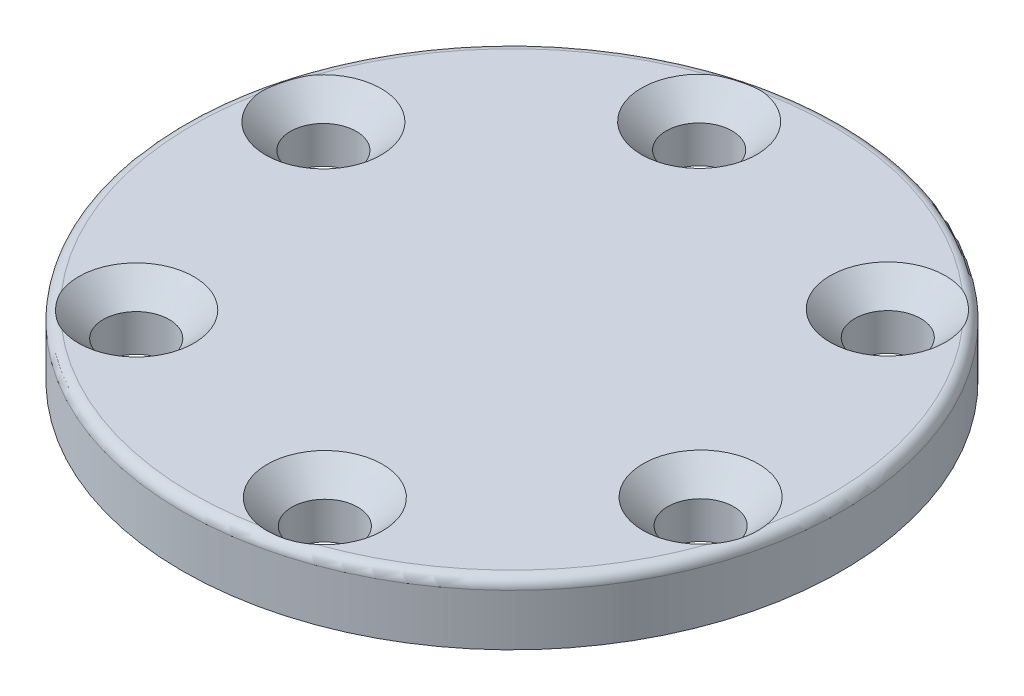
ISO-10303-21;
HEADER;
FILE_DESCRIPTION(('STEP AP214'),'2;1');
FILE_NAME('part.step','',(''),(''),'','','');
FILE_SCHEMA(('AUTOMOTIVE_DESIGN { 1 0 10303 214 1 1 1 1 }'));
ENDSEC;
DATA;
#1=APPLICATION_CONTEXT('core data for automotive mechanical design processes');
#2=APPLICATION_PROTOCOL_DEFINITION('international standard','automotive_design',2000,#1);
#3=PRODUCT_CONTEXT('',#1,'mechanical');
#4=PRODUCT('Part','Part','',(#3));
#5=PRODUCT_RELATED_PRODUCT_CATEGORY('part','',(#4));
#6=PRODUCT_DEFINITION_FORMATION('','',#4);
#7=PRODUCT_DEFINITION_CONTEXT('part definition',#1,'design');
#8=PRODUCT_DEFINITION('design','',#6,#7);
#9=PRODUCT_DEFINITION_SHAPE('','',#8);
#10=(LENGTH_UNIT() NAMED_UNIT(*) SI_UNIT(.MILLI.,.METRE.));
#11=(NAMED_UNIT(*) PLANE_ANGLE_UNIT() SI_UNIT($,.RADIAN.));
#12=(NAMED_UNIT(*) SI_UNIT($,.STERADIAN.) SOLID_ANGLE_UNIT());
#13=UNCERTAINTY_MEASURE_WITH_UNIT(LENGTH_MEASURE(1.E-05),#10,'distance_accuracy_value','');
#14=(GEOMETRIC_REPRESENTATION_CONTEXT(3) GLOBAL_UNCERTAINTY_ASSIGNED_CONTEXT((#13)) GLOBAL_UNIT_ASSIGNED_CONTEXT((#10,
#11,#12)) REPRESENTATION_CONTEXT('',''));
#15=CARTESIAN_POINT('',(0.,0.,0.));
#16=DIRECTION('',(0.,0.,1.));
#17=DIRECTION('',(1.,0.,0.));
#18=AXIS2_PLACEMENT_3D('',#15,#16,#17);
#19=CARTESIAN_POINT('',(27.1383866400148,3.,2.07384475105819));
#20=DIRECTION('',(0.,1.,0.));
#21=DIRECTION('',(0.,0.,1.));
#22=AXIS2_PLACEMENT_3D('',#19,#20,#21);
#23=PLANE('',#22);
#24=CARTESIAN_POINT('',(23.7717611025677,3.,-10.3790999806351));
#25=DIRECTION('',(0.,1.,0.));
#26=DIRECTION('',(0.,0.,1.));
#27=AXIS2_PLACEMENT_3D('',#24,#25,#26);
#28=CIRCLE('',#27,2.80000000000002);
#29=CARTESIAN_POINT('',(24.203075595972,3.,-13.1456805068045));
#30=VERTEX_POINT('',#29);
#31=CARTESIAN_POINT('',(22.0052066267614,3.,-12.5514915852978));
#32=VERTEX_POINT('',#31);
#33=EDGE_CURVE('E281',#30,#32,#28,.F.);
#34=ORIENTED_EDGE('',*,*,#33,.T.);
#35=CARTESIAN_POINT('',(27.1383866400148,3.,2.07384475105819));
#36=DIRECTION('',(0.,1.,0.));
#37=DIRECTION('',(0.,0.,1.));
#38=AXIS2_PLACEMENT_3D('',#35,#36,#37);
#39=CIRCLE('',#38,15.5);
#40=CARTESIAN_POINT('',(12.4902356111447,3.,-2.99386394572104));
#41=VERTEX_POINT('',#40);
#42=EDGE_CURVE('E122',#32,#41,#39,.T.);
#43=ORIENTED_EDGE('',*,*,#42,.T.);
#44=CARTESIAN_POINT('',(14.6705073817217,3.,-1.23704437432932));
#45=DIRECTION('',(0.,1.,0.));
#46=DIRECTION('',(0.,0.,1.));
#47=AXIS2_PLACEMENT_3D('',#44,#45,#46);
#48=CIRCLE('',#47,2.80000000000002);
#49=CARTESIAN_POINT('',(11.9058838272124,3.,-0.793359123445086));
#50=VERTEX_POINT('',#49);
#51=EDGE_CURVE('E278',#41,#50,#48,.F.);
#52=ORIENTED_EDGE('',*,*,#51,.T.);
#53=CARTESIAN_POINT('',(27.1383866400148,3.,2.07384475105819));
#54=DIRECTION('',(0.,1.,0.));
#55=DIRECTION('',(0.,0.,1.));
#56=AXIS2_PLACEMENT_3D('',#53,#54,#55);
#57=CIRCLE('',#56,15.5);
#58=CARTESIAN_POINT('',(15.4255466551902,3.,12.2256613121419));
#59=VERTEX_POINT('',#58);
#60=EDGE_CURVE('E110',#50,#59,#57,.T.);
#61=ORIENTED_EDGE('',*,*,#60,.T.);
#62=CARTESIAN_POINT('',(18.0371329191695,3.,11.2159003573638));
#63=DIRECTION('',(0.,1.,0.));
#64=DIRECTION('',(0.,0.,1.));
#65=AXIS2_PLACEMENT_3D('',#62,#63,#64);
#66=CIRCLE('',#65,2.80000000000002);
#67=CARTESIAN_POINT('',(17.0390638404652,3.,13.8319772129119));
#68=VERTEX_POINT('',#67);
#69=EDGE_CURVE('E100',#59,#68,#66,.F.);
#70=ORIENTED_EDGE('',*,*,#69,.T.);
#71=CARTESIAN_POINT('',(27.1383866400148,3.,2.07384475105819));
#72=DIRECTION('',(0.,1.,0.));
#73=DIRECTION('',(0.,0.,1.));
#74=AXIS2_PLACEMENT_3D('',#71,#72,#73);
#75=CIRCLE('',#74,15.5);
#76=CARTESIAN_POINT('',(30.0736976840593,3.,17.2933700089206));
#77=VERTEX_POINT('',#76);
#78=EDGE_CURVE('E108',#68,#77,#75,.T.);
#79=ORIENTED_EDGE('',*,*,#78,.T.);
#80=CARTESIAN_POINT('',(30.5050121774633,3.,14.5267894827512));
#81=DIRECTION('',(0.,1.,0.));
#82=DIRECTION('',(0.,0.,1.));
#83=AXIS2_PLACEMENT_3D('',#80,#81,#82);
#84=CIRCLE('',#83,2.80000000000002);
#85=CARTESIAN_POINT('',(32.2715666532698,3.,16.6991810874136));
#86=VERTEX_POINT('',#85);
#87=EDGE_CURVE('E113',#77,#86,#84,.F.);
#88=ORIENTED_EDGE('',*,*,#87,.T.);
#89=CARTESIAN_POINT('',(27.1383866400148,3.,2.07384475105819));
#90=DIRECTION('',(0.,1.,0.));
#91=DIRECTION('',(0.,0.,1.));
#92=AXIS2_PLACEMENT_3D('',#89,#90,#91);
#93=CIRCLE('',#92,15.5);
#94=CARTESIAN_POINT('',(41.7865376688841,3.,7.14155344783979));
#95=VERTEX_POINT('',#94);
#96=EDGE_CURVE('E118',#86,#95,#93,.T.);
#97=ORIENTED_EDGE('',*,*,#96,.T.);
#98=CARTESIAN_POINT('',(39.6062658983092,3.,5.38473387644533));
#99=DIRECTION('',(0.,1.,0.));
#100=DIRECTION('',(0.,0.,1.));
#101=AXIS2_PLACEMENT_3D('',#98,#99,#100);
#102=CIRCLE('',#101,2.80000000000002);
#103=CARTESIAN_POINT('',(42.370889452818,3.,4.94104862555732));
#104=VERTEX_POINT('',#103);
#105=EDGE_CURVE('E288',#95,#104,#102,.F.);
#106=ORIENTED_EDGE('',*,*,#105,.T.);
#107=CARTESIAN_POINT('',(27.1383866400148,3.,2.07384475105819));
#108=DIRECTION('',(0.,1.,0.));
#109=DIRECTION('',(0.,0.,1.));
#110=AXIS2_PLACEMENT_3D('',#107,#108,#109);
#111=CIRCLE('',#110,15.5);
#112=CARTESIAN_POINT('',(38.8512266248422,3.,-8.0779718100223));
#113=VERTEX_POINT('',#112);
#114=EDGE_CURVE('E124',#104,#113,#111,.T.);
#115=ORIENTED_EDGE('',*,*,#114,.T.);
#116=CARTESIAN_POINT('',(36.2396403608614,3.,-7.06821085524782));
#117=DIRECTION('',(0.,1.,0.));
#118=DIRECTION('',(0.,0.,1.));
#119=AXIS2_PLACEMENT_3D('',#116,#117,#118);
#120=CIRCLE('',#119,2.80000000000002);
#121=CARTESIAN_POINT('',(37.2377094395624,3.,-9.68428771079718));
#122=VERTEX_POINT('',#121);
#123=EDGE_CURVE('E284',#113,#122,#120,.F.);
#124=ORIENTED_EDGE('',*,*,#123,.T.);
#125=CARTESIAN_POINT('',(27.1383866400148,3.,2.07384475105819));
#126=DIRECTION('',(0.,1.,0.));
#127=DIRECTION('',(0.,0.,1.));
#128=AXIS2_PLACEMENT_3D('',#125,#126,#127);
#129=CIRCLE('',#128,15.5);
#130=EDGE_CURVE('E311',#122,#30,#129,.T.);
#131=ORIENTED_EDGE('',*,*,#130,.T.);
#132=EDGE_LOOP('',(#34,#43,#52,#61,#70,#79,#88,#97,#106,#115,#124,#131));
#133=FACE_BOUND('',#132,.T.);
#134=ADVANCED_FACE('F41',(#133),#23,.T.);
#135=CARTESIAN_POINT('',(27.1383866400148,0.,2.07384475105819));
#136=DIRECTION('',(0.,1.,0.));
#137=DIRECTION('',(0.,0.,1.));
#138=AXIS2_PLACEMENT_3D('',#135,#136,#137);
#139=PLANE('',#138);
#140=CARTESIAN_POINT('',(27.1383866400148,0.,2.07384475105819));
#141=DIRECTION('',(0.,1.,0.));
#142=DIRECTION('',(0.,0.,1.));
#143=AXIS2_PLACEMENT_3D('',#140,#141,#142);
#144=CIRCLE('',#143,16.);
#145=CARTESIAN_POINT('',(27.1383866400148,0.,18.0738447510582));
#146=VERTEX_POINT('',#145);
#147=EDGE_CURVE('E270',#146,#146,#144,.T.);
#148=ORIENTED_EDGE('',*,*,#147,.F.);
#149=EDGE_LOOP('',(#148));
#150=FACE_BOUND('',#149,.T.);
#151=CARTESIAN_POINT('',(23.7717611025677,0.,-10.3790999806351));
#152=DIRECTION('',(0.,1.,0.));
#153=DIRECTION('',(0.,0.,1.));
#154=AXIS2_PLACEMENT_3D('',#151,#152,#153);
#155=CIRCLE('',#154,1.6);
#156=CARTESIAN_POINT('',(23.7717611025677,0.,-8.77909998063515));
#157=VERTEX_POINT('',#156);
#158=EDGE_CURVE('E266',#157,#157,#155,.T.);
#159=ORIENTED_EDGE('',*,*,#158,.T.);
#160=EDGE_LOOP('',(#159));
#161=FACE_BOUND('',#160,.T.);
#162=CARTESIAN_POINT('',(36.2396403608614,0.,-7.06821085524782));
#163=DIRECTION('',(0.,1.,0.));
#164=DIRECTION('',(0.,0.,1.));
#165=AXIS2_PLACEMENT_3D('',#162,#163,#164);
#166=CIRCLE('',#165,1.6);
#167=CARTESIAN_POINT('',(36.2396403608614,0.,-5.46821085524782));
#168=VERTEX_POINT('',#167);
#169=EDGE_CURVE('E262',#168,#168,#166,.T.);
#170=ORIENTED_EDGE('',*,*,#169,.T.);
#171=EDGE_LOOP('',(#170));
#172=FACE_BOUND('',#171,.T.);
#173=CARTESIAN_POINT('',(39.6062658983092,0.,5.38473387644533));
#174=DIRECTION('',(0.,1.,0.));
#175=DIRECTION('',(0.,0.,1.));
#176=AXIS2_PLACEMENT_3D('',#173,#174,#175);
#177=CIRCLE('',#176,1.6);
#178=CARTESIAN_POINT('',(39.6062658983092,0.,6.98473387644533));
#179=VERTEX_POINT('',#178);
#180=EDGE_CURVE('E258',#179,#179,#177,.T.);
#181=ORIENTED_EDGE('',*,*,#180,.T.);
#182=EDGE_LOOP('',(#181));
#183=FACE_BOUND('',#182,.T.);
#184=CARTESIAN_POINT('',(30.5050121774633,0.,14.5267894827512));
#185=DIRECTION('',(0.,1.,0.));
#186=DIRECTION('',(0.,0.,1.));
#187=AXIS2_PLACEMENT_3D('',#184,#185,#186);
#188=CIRCLE('',#187,1.6);
#189=CARTESIAN_POINT('',(30.5050121774633,0.,16.1267894827511));
#190=VERTEX_POINT('',#189);
#191=EDGE_CURVE('E252',#190,#190,#188,.T.);
#192=ORIENTED_EDGE('',*,*,#191,.T.);
#193=EDGE_LOOP('',(#192));
#194=FACE_BOUND('',#193,.T.);
#195=CARTESIAN_POINT('',(18.0371329191695,0.,11.2159003573638));
#196=DIRECTION('',(0.,1.,0.));
#197=DIRECTION('',(0.,0.,1.));
#198=AXIS2_PLACEMENT_3D('',#195,#196,#197);
#199=CIRCLE('',#198,1.6);
#200=CARTESIAN_POINT('',(18.0371329191695,0.,12.8159003573638));
#201=VERTEX_POINT('',#200);
#202=EDGE_CURVE('E248',#201,#201,#199,.T.);
#203=ORIENTED_EDGE('',*,*,#202,.T.);
#204=EDGE_LOOP('',(#203));
#205=FACE_BOUND('',#204,.T.);
#206=CARTESIAN_POINT('',(14.6705073817217,0.,-1.23704437432932));
#207=DIRECTION('',(0.,1.,0.));
#208=DIRECTION('',(0.,0.,1.));
#209=AXIS2_PLACEMENT_3D('',#206,#207,#208);
#210=CIRCLE('',#209,1.6);
#211=CARTESIAN_POINT('',(14.6705073817217,0.,0.362955625670683));
#212=VERTEX_POINT('',#211);
#213=EDGE_CURVE('E245',#212,#212,#210,.T.);
#214=ORIENTED_EDGE('',*,*,#213,.T.);
#215=EDGE_LOOP('',(#214));
#216=FACE_BOUND('',#215,.T.);
#217=ADVANCED_FACE('F209',(#150,#161,#172,#183,#194,#205,#216),#139,.F.);
#218=CARTESIAN_POINT('',(27.1383866400148,3.,2.07384475105819));
#219=DIRECTION('',(0.,-1.,0.));
#220=DIRECTION('',(0.,0.,-1.));
#221=AXIS2_PLACEMENT_3D('',#218,#219,#220);
#222=CYLINDRICAL_SURFACE('',#221,16.);
#223=CARTESIAN_POINT('',(27.1383866400148,2.5,2.07384475105819));
#224=DIRECTION('',(0.,1.,0.));
#225=DIRECTION('',(0.,0.,1.));
#226=AXIS2_PLACEMENT_3D('',#223,#224,#225);
#227=CIRCLE('',#226,16.);
#228=CARTESIAN_POINT('',(27.1383866400148,2.5,18.0738447510582));
#229=VERTEX_POINT('',#228);
#230=EDGE_CURVE('E11',#229,#229,#227,.F.);
#231=ORIENTED_EDGE('',*,*,#230,.T.);
#232=EDGE_LOOP('',(#231));
#233=FACE_BOUND('',#232,.T.);
#234=ORIENTED_EDGE('',*,*,#147,.T.);
#235=EDGE_LOOP('',(#234));
#236=FACE_BOUND('',#235,.T.);
#237=ADVANCED_FACE('F205',(#233,#236),#222,.T.);
#238=CARTESIAN_POINT('',(23.7717611025677,3.,-10.3790999806351));
#239=DIRECTION('',(0.,-1.,0.));
#240=DIRECTION('',(0.,0.,-1.));
#241=AXIS2_PLACEMENT_3D('',#238,#239,#240);
#242=CYLINDRICAL_SURFACE('',#241,1.6);
#243=CARTESIAN_POINT('',(23.7717611025677,1.79999999999999,-10.3790999806351));
#244=DIRECTION('',(0.,1.,0.));
#245=DIRECTION('',(0.,0.,1.));
#246=AXIS2_PLACEMENT_3D('',#243,#244,#245);
#247=CIRCLE('',#246,1.6);
#248=CARTESIAN_POINT('',(23.7717611025677,1.79999999999999,-8.77909998063515));
#249=VERTEX_POINT('',#248);
#250=EDGE_CURVE('E305',#249,#249,#247,.T.);
#251=ORIENTED_EDGE('',*,*,#250,.T.);
#252=EDGE_LOOP('',(#251));
#253=FACE_BOUND('',#252,.T.);
#254=ORIENTED_EDGE('',*,*,#158,.F.);
#255=EDGE_LOOP('',(#254));
#256=FACE_BOUND('',#255,.T.);
#257=ADVANCED_FACE('F208',(#253,#256),#242,.F.);
#258=CARTESIAN_POINT('',(36.2396403608614,3.,-7.06821085524782));
#259=DIRECTION('',(0.,-1.,0.));
#260=DIRECTION('',(0.,0.,-1.));
#261=AXIS2_PLACEMENT_3D('',#258,#259,#260);
#262=CYLINDRICAL_SURFACE('',#261,1.6);
#263=CARTESIAN_POINT('',(36.2396403608614,1.79999999999999,-7.06821085524782));
#264=DIRECTION('',(0.,1.,0.));
#265=DIRECTION('',(0.,0.,1.));
#266=AXIS2_PLACEMENT_3D('',#263,#264,#265);
#267=CIRCLE('',#266,1.6);
#268=CARTESIAN_POINT('',(36.2396403608614,1.79999999999999,-5.46821085524782));
#269=VERTEX_POINT('',#268);
#270=EDGE_CURVE('E301',#269,#269,#267,.T.);
#271=ORIENTED_EDGE('',*,*,#270,.T.);
#272=EDGE_LOOP('',(#271));
#273=FACE_BOUND('',#272,.T.);
#274=ORIENTED_EDGE('',*,*,#169,.F.);
#275=EDGE_LOOP('',(#274));
#276=FACE_BOUND('',#275,.T.);
#277=ADVANCED_FACE('F218',(#273,#276),#262,.F.);
#278=CARTESIAN_POINT('',(39.6062658983092,3.,5.38473387644533));
#279=DIRECTION('',(0.,-1.,0.));
#280=DIRECTION('',(0.,0.,-1.));
#281=AXIS2_PLACEMENT_3D('',#278,#279,#280);
#282=CYLINDRICAL_SURFACE('',#281,1.6);
#283=CARTESIAN_POINT('',(39.6062658983092,1.79999999999999,5.38473387644533));
#284=DIRECTION('',(0.,1.,0.));
#285=DIRECTION('',(0.,0.,1.));
#286=AXIS2_PLACEMENT_3D('',#283,#284,#285);
#287=CIRCLE('',#286,1.6);
#288=CARTESIAN_POINT('',(39.6062658983092,1.79999999999999,6.98473387644533));
#289=VERTEX_POINT('',#288);
#290=EDGE_CURVE('E297',#289,#289,#287,.T.);
#291=ORIENTED_EDGE('',*,*,#290,.T.);
#292=EDGE_LOOP('',(#291));
#293=FACE_BOUND('',#292,.T.);
#294=ORIENTED_EDGE('',*,*,#180,.F.);
#295=EDGE_LOOP('',(#294));
#296=FACE_BOUND('',#295,.T.);
#297=ADVANCED_FACE('F222',(#293,#296),#282,.F.);
#298=CARTESIAN_POINT('',(30.5050121774633,3.,14.5267894827512));
#299=DIRECTION('',(0.,-1.,0.));
#300=DIRECTION('',(0.,0.,-1.));
#301=AXIS2_PLACEMENT_3D('',#298,#299,#300);
#302=CYLINDRICAL_SURFACE('',#301,1.6);
#303=CARTESIAN_POINT('',(30.5050121774633,1.79999999999999,14.5267894827512));
#304=DIRECTION('',(0.,1.,0.));
#305=DIRECTION('',(0.,0.,1.));
#306=AXIS2_PLACEMENT_3D('',#303,#304,#305);
#307=CIRCLE('',#306,1.6);
#308=CARTESIAN_POINT('',(30.5050121774633,1.79999999999999,16.1267894827511));
#309=VERTEX_POINT('',#308);
#310=EDGE_CURVE('E112',#309,#309,#307,.T.);
#311=ORIENTED_EDGE('',*,*,#310,.T.);
#312=EDGE_LOOP('',(#311));
#313=FACE_BOUND('',#312,.T.);
#314=ORIENTED_EDGE('',*,*,#191,.F.);
#315=EDGE_LOOP('',(#314));
#316=FACE_BOUND('',#315,.T.);
#317=ADVANCED_FACE('F226',(#313,#316),#302,.F.);
#318=CARTESIAN_POINT('',(18.0371329191695,3.,11.2159003573638));
#319=DIRECTION('',(0.,-1.,0.));
#320=DIRECTION('',(0.,0.,-1.));
#321=AXIS2_PLACEMENT_3D('',#318,#319,#320);
#322=CYLINDRICAL_SURFACE('',#321,1.6);
#323=CARTESIAN_POINT('',(18.0371329191695,1.79999999999999,11.2159003573638));
#324=DIRECTION('',(0.,1.,0.));
#325=DIRECTION('',(0.,0.,1.));
#326=AXIS2_PLACEMENT_3D('',#323,#324,#325);
#327=CIRCLE('',#326,1.6);
#328=CARTESIAN_POINT('',(18.0371329191695,1.79999999999999,12.8159003573638));
#329=VERTEX_POINT('',#328);
#330=EDGE_CURVE('E274',#329,#329,#327,.T.);
#331=ORIENTED_EDGE('',*,*,#330,.T.);
#332=EDGE_LOOP('',(#331));
#333=FACE_BOUND('',#332,.T.);
#334=ORIENTED_EDGE('',*,*,#202,.F.);
#335=EDGE_LOOP('',(#334));
#336=FACE_BOUND('',#335,.T.);
#337=ADVANCED_FACE('F230',(#333,#336),#322,.F.);
#338=CARTESIAN_POINT('',(14.6705073817217,3.,-1.23704437432932));
#339=DIRECTION('',(0.,-1.,0.));
#340=DIRECTION('',(0.,0.,-1.));
#341=AXIS2_PLACEMENT_3D('',#338,#339,#340);
#342=CYLINDRICAL_SURFACE('',#341,1.6);
#343=CARTESIAN_POINT('',(14.6705073817217,1.79999999999999,-1.23704437432932));
#344=DIRECTION('',(0.,1.,0.));
#345=DIRECTION('',(0.,0.,1.));
#346=AXIS2_PLACEMENT_3D('',#343,#344,#345);
#347=CIRCLE('',#346,1.6);
#348=CARTESIAN_POINT('',(14.6705073817217,1.79999999999999,0.362955625670683));
#349=VERTEX_POINT('',#348);
#350=EDGE_CURVE('E242',#349,#349,#347,.T.);
#351=ORIENTED_EDGE('',*,*,#350,.T.);
#352=EDGE_LOOP('',(#351));
#353=FACE_BOUND('',#352,.T.);
#354=ORIENTED_EDGE('',*,*,#213,.F.);
#355=EDGE_LOOP('',(#354));
#356=FACE_BOUND('',#355,.T.);
#357=ADVANCED_FACE('F204',(#353,#356),#342,.F.);
#358=CARTESIAN_POINT('',(18.0371329191695,1.79999999999999,11.2159003573638));
#359=DIRECTION('',(0.,1.,0.));
#360=DIRECTION('',(0.,0.,1.));
#361=AXIS2_PLACEMENT_3D('',#358,#359,#360);
#362=CONICAL_SURFACE('',#361,1.6,0.785398163397452);
#363=ORIENTED_EDGE('',*,*,#69,.F.);
#364=CARTESIAN_POINT('',(15.4255466551902,3.,12.2256613121419));
#365=CARTESIAN_POINT('',(15.4369923101417,2.99998768770194,12.255230487848));
#366=CARTESIAN_POINT('',(15.4492341087631,2.99965556843646,12.2844768940821));
#367=CARTESIAN_POINT('',(15.4751054402039,2.99853655350427,12.3423213717468));
#368=CARTESIAN_POINT('',(15.4887341302601,2.99774993267797,12.3709198241483));
#369=CARTESIAN_POINT('',(15.5171595258716,2.99590820088059,12.4274426879877));
#370=CARTESIAN_POINT('',(15.5319537536436,2.9948536494084,12.4553683728721));
#371=CARTESIAN_POINT('',(15.5626076772006,2.99259619681635,12.5106264540222));
#372=CARTESIAN_POINT('',(15.5784675618831,2.99139326936374,12.5379587439612));
#373=CARTESIAN_POINT('',(15.6276322040858,2.98770309254106,12.6193307345492));
#374=CARTESIAN_POINT('',(15.6623930182709,2.98514457499136,12.6724933438453));
#375=CARTESIAN_POINT('',(15.7352011125971,2.98038713879261,12.7765718610056));
#376=CARTESIAN_POINT('',(15.7732508810453,2.97818849611607,12.8274860229885));
#377=CARTESIAN_POINT('',(15.8714422890538,2.97360146194901,12.9512847874124));
#378=CARTESIAN_POINT('',(15.9333277510663,2.97164089810886,13.0228109137072));
#379=CARTESIAN_POINT('',(16.0626372114863,2.96983600988871,13.1607131770893));
#380=CARTESIAN_POINT('',(16.1300627670596,2.96999228252874,13.2270878559841));
#381=CARTESIAN_POINT('',(16.2698465704344,2.97237269534006,13.3540397807778));
#382=CARTESIAN_POINT('',(16.3421925950188,2.97459187315201,13.414630554429));
#383=CARTESIAN_POINT('',(16.4917693159527,2.98048228507808,13.529295974699));
#384=CARTESIAN_POINT('',(16.5689964621261,2.98415247381319,13.5833752759881));
#385=CARTESIAN_POINT('',(16.710664163621,2.99073640091246,13.6723255097443));
#386=CARTESIAN_POINT('',(16.774097960735,2.99363559135205,13.7087865518481));
#387=CARTESIAN_POINT('',(16.8716168475741,2.99709477777818,13.7588599956759));
#388=CARTESIAN_POINT('',(16.9045025265929,2.99809932138951,13.7747753384928));
#389=CARTESIAN_POINT('',(16.9711363235509,2.99954281993959,13.8048051803689));
#390=CARTESIAN_POINT('',(17.004885310822,2.999981179883,13.8189177709317));
#391=CARTESIAN_POINT('',(17.0390638404627,3.00000000000426,13.8319772129156));
#392=B_SPLINE_CURVE_WITH_KNOTS('',3,(#364,#365,#366,#367,#368,#369,#370,#371,#372,#373,#374,
#375,#376,#377,#378,#379,#380,#381,#382,#383,#384,#385,#386,#387,#388,#389,#390,#391),
.UNSPECIFIED.,.F.,.F.,(4,2,2,2,2,2,2,2,2,2,2,2,2,4),(0.,0.0950884597456169,0.190119478893086,
0.284953660141675,0.379804696189655,0.570355038435373,0.761050827768602,1.04449671310302,
1.32802254150361,1.61086810293525,1.89351025889478,2.11289237160056,2.22248493740965,
2.33219257922141),.UNSPECIFIED.);
#393=EDGE_CURVE('E96',#59,#68,#392,.T.);
#394=ORIENTED_EDGE('',*,*,#393,.T.);
#395=EDGE_LOOP('',(#363,#394));
#396=FACE_BOUND('',#395,.T.);
#397=ORIENTED_EDGE('',*,*,#330,.F.);
#398=EDGE_LOOP('',(#397));
#399=FACE_BOUND('',#398,.T.);
#400=ADVANCED_FACE('F98',(#396,#399),#362,.F.);
#401=CARTESIAN_POINT('',(30.5050121774633,1.79999999999999,14.5267894827512));
#402=DIRECTION('',(0.,1.,0.));
#403=DIRECTION('',(0.,0.,1.));
#404=AXIS2_PLACEMENT_3D('',#401,#402,#403);
#405=CONICAL_SURFACE('',#404,1.6,0.785398163397452);
#406=ORIENTED_EDGE('',*,*,#87,.F.);
#407=CARTESIAN_POINT('',(30.0736976840593,3.,17.2933700089206));
#408=CARTESIAN_POINT('',(30.1050281688655,2.99998768770194,17.2982423688226));
#409=CARTESIAN_POINT('',(30.1364771989443,2.99965556843646,17.3022638633455));
#410=CARTESIAN_POINT('',(30.1995076517909,2.99853655350426,17.3087808719205));
#411=CARTESIAN_POINT('',(30.2310889831076,2.99774993267796,17.3112773063122));
#412=CARTESIAN_POINT('',(30.2942519168929,2.99590820088058,17.3149216235198));
#413=CARTESIAN_POINT('',(30.3258333833068,2.99485364940839,17.3160722888821));
#414=CARTESIAN_POINT('',(30.3890152471257,2.99259619681633,17.3171542529312));
#415=CARTESIAN_POINT('',(30.4206156468977,2.99139326936372,17.3170853348645));
#416=CARTESIAN_POINT('',(30.5156681790046,2.98770309254103,17.315193501043));
#417=CARTESIAN_POINT('',(30.579088756279,2.98514457499132,17.3116710575506));
#418=CARTESIAN_POINT('',(30.7056274432911,2.98038713879255,17.3006566568433));
#419=CARTESIAN_POINT('',(30.7687452852046,2.978188496116,17.2931616717505));
#420=CARTESIAN_POINT('',(30.9250538641571,2.9736014619489,17.2700248001939));
#421=CARTESIAN_POINT('',(31.0179400375691,2.97164089810874,17.2521934811135));
#422=CARTESIAN_POINT('',(31.2020216311074,2.96983600988854,17.2091593351313));
#423=CARTESIAN_POINT('',(31.2932165669851,2.96999228252856,17.183954430588));
#424=CARTESIAN_POINT('',(31.4730520606032,2.97237269533986,17.1263740682248));
#425=CARTESIAN_POINT('',(31.5616982221125,2.9745918731518,17.0940159598975));
#426=CARTESIAN_POINT('',(31.7357897494689,2.98048228507786,17.0218114298891));
#427=CARTESIAN_POINT('',(31.821237371291,2.98415247381298,16.9819704100857));
#428=CARTESIAN_POINT('',(31.9691043841445,2.99073640091231,16.9037576985732));
#429=CARTESIAN_POINT('',(32.0323974714124,2.99363559135194,16.8670529398656));
#430=CARTESIAN_POINT('',(32.1245217892426,2.99709477777813,16.8076358284276));
#431=CARTESIAN_POINT('',(32.1547477199416,2.99809932138948,16.7871136663849));
#432=CARTESIAN_POINT('',(32.2140712243574,2.99954281993959,16.7444220264064));
#433=CARTESIAN_POINT('',(32.2431675799338,2.999981179883,16.7222508413588));
#434=CARTESIAN_POINT('',(32.2715666532717,3.00000000000426,16.6991810874176));
#435=B_SPLINE_CURVE_WITH_KNOTS('',3,(#407,#408,#409,#410,#411,#412,#413,#414,#415,#416,#417,
#418,#419,#420,#421,#422,#423,#424,#425,#426,#427,#428,#429,#430,#431,#432,#433,#434),
.UNSPECIFIED.,.F.,.F.,(4,2,2,2,2,2,2,2,2,2,2,2,2,4),(0.,0.0950884597455397,0.190119478892934,
0.284953660141447,0.379804696189347,0.5703550384349,0.761050827767964,1.04449671310251,
1.32802254150323,1.61086810293499,1.89351025889465,2.1128923716023,2.22248493741234,
2.33219257922503),.UNSPECIFIED.);
#436=EDGE_CURVE('E103',#77,#86,#435,.T.);
#437=ORIENTED_EDGE('',*,*,#436,.T.);
#438=EDGE_LOOP('',(#406,#437));
#439=FACE_BOUND('',#438,.T.);
#440=ORIENTED_EDGE('',*,*,#310,.F.);
#441=EDGE_LOOP('',(#440));
#442=FACE_BOUND('',#441,.T.);
#443=ADVANCED_FACE('F191',(#439,#442),#405,.F.);
#444=CARTESIAN_POINT('',(39.6062658983092,1.79999999999999,5.38473387644533));
#445=DIRECTION('',(0.,1.,0.));
#446=DIRECTION('',(0.,0.,1.));
#447=AXIS2_PLACEMENT_3D('',#444,#445,#446);
#448=CONICAL_SURFACE('',#447,1.6,0.785398163397452);
#449=ORIENTED_EDGE('',*,*,#105,.F.);
#450=CARTESIAN_POINT('',(41.7865376688841,3.,7.14155344783979));
#451=CARTESIAN_POINT('',(41.8064224987387,2.99998768770194,7.11685663203579));
#452=CARTESIAN_POINT('',(41.8256297301962,2.99965556843646,7.09163172032465));
#453=CARTESIAN_POINT('',(41.862788851602,2.99853655350426,7.04030425123499));
#454=CARTESIAN_POINT('',(41.8807414928625,2.99774993267796,7.01420223322536));
#455=CARTESIAN_POINT('',(41.9154790310364,2.99590820088057,6.9613236865936));
#456=CARTESIAN_POINT('',(41.9322662696784,2.99485364940838,6.9345486670716));
#457=CARTESIAN_POINT('',(41.9647942099403,2.99259619681632,6.88037254997058));
#458=CARTESIAN_POINT('',(41.9805347250298,2.99139326936371,6.852971341965));
#459=CARTESIAN_POINT('',(42.0264226149341,2.98770309254101,6.76970751755571));
#460=CARTESIAN_POINT('',(42.0550823780235,2.98514457499129,6.71302246476724));
#461=CARTESIAN_POINT('',(42.1088129707095,2.98038713879249,6.59792954689974));
#462=CARTESIAN_POINT('',(42.133881044175,2.97818849611594,6.53952039982422));
#463=CARTESIAN_POINT('',(42.1919982151192,2.9736014619488,6.39258476384364));
#464=CARTESIAN_POINT('',(42.2229989265187,2.97164089810862,6.30322731846839));
#465=CARTESIAN_POINT('',(42.2777710596373,2.96983600988838,6.12229090910391));
#466=CARTESIAN_POINT('',(42.3015404399417,2.96999228252838,6.03071132566574));
#467=CARTESIAN_POINT('',(42.3415921301852,2.97237269533965,5.84617903850862));
#468=CARTESIAN_POINT('',(42.3578922671101,2.97459187315159,5.75323015652995));
#469=CARTESIAN_POINT('',(42.3824070735329,2.98048228507765,5.56636020625131));
#470=CARTESIAN_POINT('',(42.3906275491816,2.98415247381277,5.47243988515875));
#471=CARTESIAN_POINT('',(42.3968268605398,2.99073640091216,5.305276939889));
#472=CARTESIAN_POINT('',(42.3966861506933,2.99363559135183,5.23211113907663));
#473=CARTESIAN_POINT('',(42.3912915816835,2.99709477777808,5.12262058380945));
#474=CARTESIAN_POINT('',(42.3886318333635,2.99809932138944,5.08618307894937));
#475=CARTESIAN_POINT('',(42.3813215408207,2.99954281993958,5.01346159709391));
#476=CARTESIAN_POINT('',(42.3766689091256,2.999981179883,4.97717782148313));
#477=CARTESIAN_POINT('',(42.3708894528224,3.00000000000426,4.94104862555765));
#478=B_SPLINE_CURVE_WITH_KNOTS('',3,(#450,#451,#452,#453,#454,#455,#456,#457,#458,#459,#460,
#461,#462,#463,#464,#465,#466,#467,#468,#469,#470,#471,#472,#473,#474,#475,#476,#477),
.UNSPECIFIED.,.F.,.F.,(4,2,2,2,2,2,2,2,2,2,2,2,2,4),(0.,0.0950884597454624,0.190119478892774,
0.284953660141205,0.379804696189028,0.57035503843442,0.761050827767311,1.04449671310198,
1.32802254150282,1.61086810293472,1.89351025889452,2.11289237160403,2.22248493741498,
2.33219257922859),.UNSPECIFIED.);
#479=EDGE_CURVE('E173',#95,#104,#478,.T.);
#480=ORIENTED_EDGE('',*,*,#479,.T.);
#481=EDGE_LOOP('',(#449,#480));
#482=FACE_BOUND('',#481,.T.);
#483=ORIENTED_EDGE('',*,*,#290,.F.);
#484=EDGE_LOOP('',(#483));
#485=FACE_BOUND('',#484,.T.);
#486=ADVANCED_FACE('F185',(#482,#485),#448,.F.);
#487=CARTESIAN_POINT('',(36.2396403608614,1.79999999999999,-7.06821085524782));
#488=DIRECTION('',(0.,1.,0.));
#489=DIRECTION('',(0.,0.,1.));
#490=AXIS2_PLACEMENT_3D('',#487,#488,#489);
#491=CONICAL_SURFACE('',#490,1.6,0.785398163397452);
#492=ORIENTED_EDGE('',*,*,#123,.F.);
#493=CARTESIAN_POINT('',(38.8512266248422,3.,-8.0779718100223));
#494=CARTESIAN_POINT('',(38.8397809698907,2.99998768770194,-8.10754098572835));
#495=CARTESIAN_POINT('',(38.8275391712694,2.99965556843646,-8.13678739196243));
#496=CARTESIAN_POINT('',(38.8016678398287,2.99853655350426,-8.19463186962706));
#497=CARTESIAN_POINT('',(38.7880391497726,2.99774993267796,-8.22323032202849));
#498=CARTESIAN_POINT('',(38.7596137541612,2.99590820088057,-8.27975318586784));
#499=CARTESIAN_POINT('',(38.7448195263893,2.99485364940838,-8.30767887075221));
#500=CARTESIAN_POINT('',(38.7141656028324,2.99259619681632,-8.36293695190232));
#501=CARTESIAN_POINT('',(38.6983057181499,2.99139326936371,-8.39026924184127));
#502=CARTESIAN_POINT('',(38.6491410759474,2.98770309254101,-8.47164123242914));
#503=CARTESIAN_POINT('',(38.6143802617624,2.98514457499129,-8.52480384172524));
#504=CARTESIAN_POINT('',(38.5415721674365,2.98038713879249,-8.62888235888546));
#505=CARTESIAN_POINT('',(38.5035223989885,2.97818849611594,-8.67979652086827));
#506=CARTESIAN_POINT('',(38.4053309909802,2.9736014619488,-8.80359528529234));
#507=CARTESIAN_POINT('',(38.3434455289677,2.97164089810861,-8.87512141158732));
#508=CARTESIAN_POINT('',(38.2141360685478,2.96983600988838,-9.01302367496968));
#509=CARTESIAN_POINT('',(38.1467105129746,2.96999228252838,-9.07939835386466));
#510=CARTESIAN_POINT('',(38.0069267095998,2.97237269533965,-9.2063502786586));
#511=CARTESIAN_POINT('',(37.9345806850154,2.97459187315158,-9.26694105231004));
#512=CARTESIAN_POINT('',(37.7850039640815,2.98048228507765,-9.38160647258035));
#513=CARTESIAN_POINT('',(37.7077768179081,2.98415247381277,-9.43568577386961));
#514=CARTESIAN_POINT('',(37.5661091164122,2.99073640091215,-9.52463600762671));
#515=CARTESIAN_POINT('',(37.5026753192972,2.99363559135183,-9.56109704973124));
#516=CARTESIAN_POINT('',(37.4051564324565,2.99709477777808,-9.61117049355996));
#517=CARTESIAN_POINT('',(37.3722707534371,2.99809932138944,-9.62708583637715));
#518=CARTESIAN_POINT('',(37.305636956478,2.99954281993958,-9.65711567825372));
#519=CARTESIAN_POINT('',(37.2718879692063,2.999981179883,-9.67122826881674));
#520=CARTESIAN_POINT('',(37.2377094395649,3.00000000000426,-9.68428771080083));
#521=B_SPLINE_CURVE_WITH_KNOTS('',3,(#493,#494,#495,#496,#497,#498,#499,#500,#501,#502,#503,
#504,#505,#506,#507,#508,#509,#510,#511,#512,#513,#514,#515,#516,#517,#518,#519,#520),
.UNSPECIFIED.,.F.,.F.,(4,2,2,2,2,2,2,2,2,2,2,2,2,4),(0.,0.0950884597454572,0.190119478892766,
0.284953660141193,0.379804696189015,0.570355038434396,0.76105082776729,1.04449671310197,
1.32802254150281,1.61086810293471,1.89351025889452,2.11289237160407,2.22248493741503,
2.33219257922867),.UNSPECIFIED.);
#522=EDGE_CURVE('E166',#113,#122,#521,.T.);
#523=ORIENTED_EDGE('',*,*,#522,.T.);
#524=EDGE_LOOP('',(#492,#523));
#525=FACE_BOUND('',#524,.T.);
#526=ORIENTED_EDGE('',*,*,#270,.F.);
#527=EDGE_LOOP('',(#526));
#528=FACE_BOUND('',#527,.T.);
#529=ADVANCED_FACE('F156',(#525,#528),#491,.F.);
#530=CARTESIAN_POINT('',(23.7717611025677,1.79999999999999,-10.3790999806351));
#531=DIRECTION('',(0.,1.,0.));
#532=DIRECTION('',(0.,0.,1.));
#533=AXIS2_PLACEMENT_3D('',#530,#531,#532);
#534=CONICAL_SURFACE('',#533,1.6,0.785398163397451);
#535=ORIENTED_EDGE('',*,*,#33,.F.);
#536=CARTESIAN_POINT('',(24.203075595972,3.,-13.1456805068045));
#537=CARTESIAN_POINT('',(24.1717451111658,2.99998768770194,-13.1505528667065));
#538=CARTESIAN_POINT('',(24.140296081087,2.99965556843647,-13.1545743612295));
#539=CARTESIAN_POINT('',(24.0772656282404,2.99853655350426,-13.1610913698044));
#540=CARTESIAN_POINT('',(24.0456842969237,2.99774993267796,-13.1635878041962));
#541=CARTESIAN_POINT('',(23.9825213631384,2.99590820088058,-13.1672321214038));
#542=CARTESIAN_POINT('',(23.9509398967245,2.99485364940839,-13.1683827867661));
#543=CARTESIAN_POINT('',(23.8877580329056,2.99259619681633,-13.1694647508152));
#544=CARTESIAN_POINT('',(23.8561576331337,2.99139326936372,-13.1693958327485));
#545=CARTESIAN_POINT('',(23.7611051010267,2.98770309254104,-13.167503998927));
#546=CARTESIAN_POINT('',(23.6976845237523,2.98514457499133,-13.1639815554346));
#547=CARTESIAN_POINT('',(23.5711458367402,2.98038713879255,-13.1529671547273));
#548=CARTESIAN_POINT('',(23.5080279948267,2.978188496116,-13.1454721696345));
#549=CARTESIAN_POINT('',(23.3517194158742,2.9736014619489,-13.1223352980779));
#550=CARTESIAN_POINT('',(23.2588332424622,2.97164089810874,-13.1045039789976));
#551=CARTESIAN_POINT('',(23.0747516489239,2.96983600988854,-13.0614698330154));
#552=CARTESIAN_POINT('',(22.9835567130462,2.96999228252856,-13.0362649284721));
#553=CARTESIAN_POINT('',(22.8037212194281,2.97237269533985,-12.9786845661089));
#554=CARTESIAN_POINT('',(22.7150750579188,2.9745918731518,-12.9463264577816));
#555=CARTESIAN_POINT('',(22.5409835305623,2.98048228507786,-12.8741219277732));
#556=CARTESIAN_POINT('',(22.4555359087403,2.98415247381298,-12.8342809079698));
#557=CARTESIAN_POINT('',(22.3076688958868,2.99073640091231,-12.7560681964574));
#558=CARTESIAN_POINT('',(22.2443758086189,2.99363559135194,-12.7193634377498));
#559=CARTESIAN_POINT('',(22.1522514907887,2.99709477777813,-12.6599463263118));
#560=CARTESIAN_POINT('',(22.1220255600896,2.99809932138948,-12.6394241642691));
#561=CARTESIAN_POINT('',(22.0627020556738,2.99954281993959,-12.5967325242905));
#562=CARTESIAN_POINT('',(22.0336057000974,2.999981179883,-12.574561339243));
#563=CARTESIAN_POINT('',(22.0052066267595,3.00000000000426,-12.5514915853018));
#564=B_SPLINE_CURVE_WITH_KNOTS('',3,(#536,#537,#538,#539,#540,#541,#542,#543,#544,#545,#546,
#547,#548,#549,#550,#551,#552,#553,#554,#555,#556,#557,#558,#559,#560,#561,#562,#563),
.UNSPECIFIED.,.F.,.F.,(4,2,2,2,2,2,2,2,2,2,2,2,2,4),(0.,0.095088459745541,0.190119478892932,
0.284953660141443,0.379804696189343,0.570355038434898,0.761050827767962,1.0444967131025,
1.32802254150323,1.610868102935,1.89351025889466,2.11289237160232,2.22248493741234,
2.33219257922504),.UNSPECIFIED.);
#565=EDGE_CURVE('E51',#30,#32,#564,.T.);
#566=ORIENTED_EDGE('',*,*,#565,.T.);
#567=EDGE_LOOP('',(#535,#566));
#568=FACE_BOUND('',#567,.T.);
#569=ORIENTED_EDGE('',*,*,#250,.F.);
#570=EDGE_LOOP('',(#569));
#571=FACE_BOUND('',#570,.T.);
#572=ADVANCED_FACE('F149',(#568,#571),#534,.F.);
#573=CARTESIAN_POINT('',(14.6705073817217,1.79999999999999,-1.23704437432932));
#574=DIRECTION('',(0.,1.,0.));
#575=DIRECTION('',(0.,0.,1.));
#576=AXIS2_PLACEMENT_3D('',#573,#574,#575);
#577=CONICAL_SURFACE('',#576,1.6,0.785398163397451);
#578=ORIENTED_EDGE('',*,*,#51,.F.);
#579=CARTESIAN_POINT('',(12.4902356111447,3.,-2.99386394572104));
#580=CARTESIAN_POINT('',(12.47035078129,2.99998768770194,-2.96916712991697));
#581=CARTESIAN_POINT('',(12.4511435498326,2.99965556843646,-2.94394221820577));
#582=CARTESIAN_POINT('',(12.4139844284267,2.99853655350427,-2.89261474911598));
#583=CARTESIAN_POINT('',(12.3960317871662,2.99774993267797,-2.86651273110629));
#584=CARTESIAN_POINT('',(12.3612942489924,2.99590820088059,-2.8136341844744));
#585=CARTESIAN_POINT('',(12.3445070103504,2.9948536494084,-2.78685916495233));
#586=CARTESIAN_POINT('',(12.3119790700885,2.99259619681635,-2.73268304785118));
#587=CARTESIAN_POINT('',(12.296238554999,2.99139326936374,-2.70528183984553));
#588=CARTESIAN_POINT('',(12.2503506650947,2.98770309254106,-2.62201801543604));
#589=CARTESIAN_POINT('',(12.2216909020053,2.98514457499136,-2.56533296264744));
#590=CARTESIAN_POINT('',(12.1679603093193,2.9803871387926,-2.45024004477967));
#591=CARTESIAN_POINT('',(12.1428922358539,2.97818849611607,-2.39183089770402));
#592=CARTESIAN_POINT('',(12.0847750649099,2.973601461949,-2.24489526172333));
#593=CARTESIAN_POINT('',(12.0537743535105,2.97164089810886,-2.15553781634812));
#594=CARTESIAN_POINT('',(11.9990022203922,2.9698360098887,-1.97460140698373));
#595=CARTESIAN_POINT('',(11.9752328400879,2.96999228252874,-1.88302182354561));
#596=CARTESIAN_POINT('',(11.9351811498447,2.97237269534006,-1.69848953638861));
#597=CARTESIAN_POINT('',(11.9188810129199,2.97459187315201,-1.60554065441));
#598=CARTESIAN_POINT('',(11.8943662064974,2.98048228507808,-1.41867070413151));
#599=CARTESIAN_POINT('',(11.8861457308489,2.98415247381319,-1.32475038303902));
#600=CARTESIAN_POINT('',(11.879946419491,2.99073640091246,-1.15758743777059));
#601=CARTESIAN_POINT('',(11.8800871293376,2.99363559135205,-1.08442163695947));
#602=CARTESIAN_POINT('',(11.8854816983473,2.99709477777818,-0.97493108169415));
#603=CARTESIAN_POINT('',(11.8881414466673,2.99809932138951,-0.938493576834684));
#604=CARTESIAN_POINT('',(11.89545173921,2.99954281993959,-0.865772094980451));
#605=CARTESIAN_POINT('',(11.9001043709049,2.999981179883,-0.829488319370286));
#606=CARTESIAN_POINT('',(11.905883827208,3.00000000000426,-0.793359123445417));
#607=B_SPLINE_CURVE_WITH_KNOTS('',3,(#579,#580,#581,#582,#583,#584,#585,#586,#587,#588,#589,
#590,#591,#592,#593,#594,#595,#596,#597,#598,#599,#600,#601,#602,#603,#604,#605,#606),
.UNSPECIFIED.,.F.,.F.,(4,2,2,2,2,2,2,2,2,2,2,2,2,4),(0.,0.0950884597456207,0.19011947889309,
0.284953660141679,0.379804696189661,0.570355038435382,0.761050827768616,1.04449671310303,
1.32802254150363,1.61086810293527,1.8935102588948,2.11289237160058,2.22248493740967,
2.33219257922142),.UNSPECIFIED.);
#608=EDGE_CURVE('E58',#41,#50,#607,.T.);
#609=ORIENTED_EDGE('',*,*,#608,.T.);
#610=EDGE_LOOP('',(#578,#609));
#611=FACE_BOUND('',#610,.T.);
#612=ORIENTED_EDGE('',*,*,#350,.F.);
#613=EDGE_LOOP('',(#612));
#614=FACE_BOUND('',#613,.T.);
#615=ADVANCED_FACE('F142',(#611,#614),#577,.F.);
#616=CARTESIAN_POINT('',(27.1383866400148,2.5,2.07384475105819));
#617=DIRECTION('',(0.,1.,0.));
#618=DIRECTION('',(0.,0.,1.));
#619=AXIS2_PLACEMENT_3D('',#616,#617,#618);
#620=TOROIDAL_SURFACE('',#619,15.5,0.5);
#621=ORIENTED_EDGE('',*,*,#230,.F.);
#622=EDGE_LOOP('',(#621));
#623=FACE_BOUND('',#622,.T.);
#624=ORIENTED_EDGE('',*,*,#608,.F.);
#625=ORIENTED_EDGE('',*,*,#42,.F.);
#626=ORIENTED_EDGE('',*,*,#565,.F.);
#627=ORIENTED_EDGE('',*,*,#130,.F.);
#628=ORIENTED_EDGE('',*,*,#522,.F.);
#629=ORIENTED_EDGE('',*,*,#114,.F.);
#630=ORIENTED_EDGE('',*,*,#479,.F.);
#631=ORIENTED_EDGE('',*,*,#96,.F.);
#632=ORIENTED_EDGE('',*,*,#436,.F.);
#633=ORIENTED_EDGE('',*,*,#78,.F.);
#634=ORIENTED_EDGE('',*,*,#393,.F.);
#635=ORIENTED_EDGE('',*,*,#60,.F.);
#636=EDGE_LOOP('',(#624,#625,#626,#627,#628,#629,#630,#631,#632,#633,#634,#635));
#637=FACE_BOUND('',#636,.T.);
#638=ADVANCED_FACE('F43',(#623,#637),#620,.T.);
#639=CLOSED_SHELL('',(#134,#217,#237,#257,#277,#297,#317,#337,#357,#400,#443,#486,#529,#572,
#615,#638));
#640=MANIFOLD_SOLID_BREP('B2',#639);
#641=ADVANCED_BREP_SHAPE_REPRESENTATION('',(#18,#640),#14);
#642=SHAPE_DEFINITION_REPRESENTATION(#9,#641);
ENDSEC;
END-ISO-10303-21;
